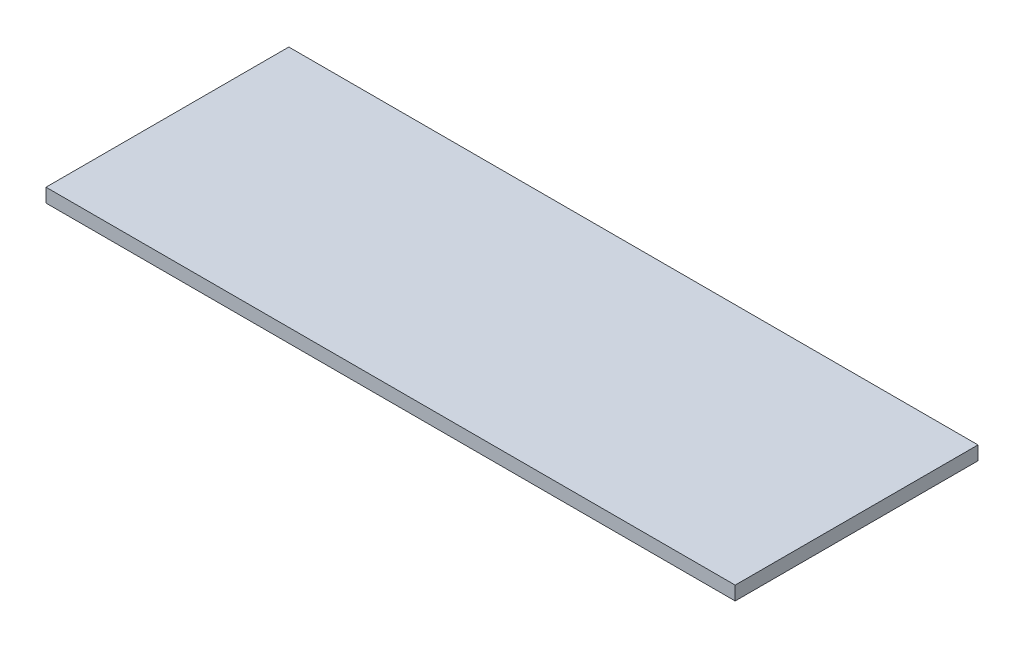
ISO-10303-21;
HEADER;
FILE_DESCRIPTION(('STEP AP214'),'2;1');
FILE_NAME('part.step','',(''),(''),'','','');
FILE_SCHEMA(('AUTOMOTIVE_DESIGN { 1 0 10303 214 1 1 1 1 }'));
ENDSEC;
DATA;
#1=APPLICATION_CONTEXT('core data for automotive mechanical design processes');
#2=APPLICATION_PROTOCOL_DEFINITION('international standard','automotive_design',2000,#1);
#3=PRODUCT_CONTEXT('',#1,'mechanical');
#4=PRODUCT('Part','Part','',(#3));
#5=PRODUCT_RELATED_PRODUCT_CATEGORY('part','',(#4));
#6=PRODUCT_DEFINITION_FORMATION('','',#4);
#7=PRODUCT_DEFINITION_CONTEXT('part definition',#1,'design');
#8=PRODUCT_DEFINITION('design','',#6,#7);
#9=PRODUCT_DEFINITION_SHAPE('','',#8);
#10=(LENGTH_UNIT() NAMED_UNIT(*) SI_UNIT(.MILLI.,.METRE.));
#11=(NAMED_UNIT(*) PLANE_ANGLE_UNIT() SI_UNIT($,.RADIAN.));
#12=(NAMED_UNIT(*) SI_UNIT($,.STERADIAN.) SOLID_ANGLE_UNIT());
#13=UNCERTAINTY_MEASURE_WITH_UNIT(LENGTH_MEASURE(1.E-05),#10,'distance_accuracy_value','');
#14=(GEOMETRIC_REPRESENTATION_CONTEXT(3) GLOBAL_UNCERTAINTY_ASSIGNED_CONTEXT((#13)) GLOBAL_UNIT_ASSIGNED_CONTEXT((#10,
#11,#12)) REPRESENTATION_CONTEXT('',''));
#15=CARTESIAN_POINT('',(0.,0.,0.));
#16=DIRECTION('',(0.,0.,1.));
#17=DIRECTION('',(1.,0.,0.));
#18=AXIS2_PLACEMENT_3D('',#15,#16,#17);
#19=CARTESIAN_POINT('',(0.,8.,0.));
#20=DIRECTION('',(0.,1.,0.));
#21=DIRECTION('',(0.,0.,1.));
#22=AXIS2_PLACEMENT_3D('',#19,#20,#21);
#23=PLANE('',#22);
#24=DIRECTION('',(0.,0.,1.));
#25=VECTOR('',#24,1.);
#26=CARTESIAN_POINT('',(-100.,8.,0.));
#27=LINE('',#26,#25);
#28=CARTESIAN_POINT('',(-100.,8.,-100.542496328956));
#29=VERTEX_POINT('',#28);
#30=CARTESIAN_POINT('',(-100.,8.,-30.0784515265633));
#31=VERTEX_POINT('',#30);
#32=EDGE_CURVE('E233',#29,#31,#27,.T.);
#33=ORIENTED_EDGE('',*,*,#32,.T.);
#34=DIRECTION('',(-1.,0.,0.));
#35=VECTOR('',#34,1.);
#36=CARTESIAN_POINT('',(0.,8.,-30.0784515265633));
#37=LINE('',#36,#35);
#38=CARTESIAN_POINT('',(100.,8.,-30.0784515265633));
#39=VERTEX_POINT('',#38);
#40=EDGE_CURVE('E226',#39,#31,#37,.T.);
#41=ORIENTED_EDGE('',*,*,#40,.F.);
#42=DIRECTION('',(0.,0.,1.));
#43=VECTOR('',#42,1.);
#44=CARTESIAN_POINT('',(100.,8.,0.));
#45=LINE('',#44,#43);
#46=CARTESIAN_POINT('',(100.,8.,-100.542496328956));
#47=VERTEX_POINT('',#46);
#48=EDGE_CURVE('E231',#47,#39,#45,.T.);
#49=ORIENTED_EDGE('',*,*,#48,.F.);
#50=DIRECTION('',(-1.,0.,0.));
#51=VECTOR('',#50,1.);
#52=CARTESIAN_POINT('',(0.,8.,-100.542496328956));
#53=LINE('',#52,#51);
#54=EDGE_CURVE('E199',#47,#29,#53,.T.);
#55=ORIENTED_EDGE('',*,*,#54,.T.);
#56=EDGE_LOOP('',(#33,#41,#49,#55));
#57=FACE_BOUND('',#56,.T.);
#58=ADVANCED_FACE('F182',(#57),#23,.T.);
#59=CARTESIAN_POINT('',(-100.,8.,0.));
#60=DIRECTION('',(1.,0.,0.));
#61=DIRECTION('',(0.,0.,-1.));
#62=AXIS2_PLACEMENT_3D('',#59,#60,#61);
#63=PLANE('',#62);
#64=DIRECTION('',(0.,0.,1.));
#65=VECTOR('',#64,1.);
#66=CARTESIAN_POINT('',(-100.,4.,0.));
#67=LINE('',#66,#65);
#68=CARTESIAN_POINT('',(-100.,4.,-100.542496328956));
#69=VERTEX_POINT('',#68);
#70=CARTESIAN_POINT('',(-100.,4.,-30.0784515265633));
#71=VERTEX_POINT('',#70);
#72=EDGE_CURVE('E243',#69,#71,#67,.T.);
#73=ORIENTED_EDGE('',*,*,#72,.T.);
#74=DIRECTION('',(0.,-1.,0.));
#75=VECTOR('',#74,1.);
#76=CARTESIAN_POINT('',(-100.,8.,-30.0784515265633));
#77=LINE('',#76,#75);
#78=EDGE_CURVE('E12',#31,#71,#77,.T.);
#79=ORIENTED_EDGE('',*,*,#78,.F.);
#80=ORIENTED_EDGE('',*,*,#32,.F.);
#81=DIRECTION('',(0.,-1.,0.));
#82=VECTOR('',#81,1.);
#83=CARTESIAN_POINT('',(-100.,8.,-100.542496328956));
#84=LINE('',#83,#82);
#85=EDGE_CURVE('E239',#29,#69,#84,.T.);
#86=ORIENTED_EDGE('',*,*,#85,.T.);
#87=EDGE_LOOP('',(#73,#79,#80,#86));
#88=FACE_BOUND('',#87,.T.);
#89=ADVANCED_FACE('F184',(#88),#63,.F.);
#90=CARTESIAN_POINT('',(0.,4.,0.));
#91=DIRECTION('',(0.,1.,0.));
#92=DIRECTION('',(0.,0.,1.));
#93=AXIS2_PLACEMENT_3D('',#90,#91,#92);
#94=PLANE('',#93);
#95=ORIENTED_EDGE('',*,*,#72,.F.);
#96=DIRECTION('',(-1.,0.,0.));
#97=VECTOR('',#96,1.);
#98=CARTESIAN_POINT('',(0.,4.,-100.542496328956));
#99=LINE('',#98,#97);
#100=CARTESIAN_POINT('',(100.,4.,-100.542496328956));
#101=VERTEX_POINT('',#100);
#102=EDGE_CURVE('E249',#101,#69,#99,.T.);
#103=ORIENTED_EDGE('',*,*,#102,.F.);
#104=DIRECTION('',(0.,0.,1.));
#105=VECTOR('',#104,1.);
#106=CARTESIAN_POINT('',(100.,4.,0.));
#107=LINE('',#106,#105);
#108=CARTESIAN_POINT('',(100.,4.,-30.0784515265633));
#109=VERTEX_POINT('',#108);
#110=EDGE_CURVE('E247',#101,#109,#107,.T.);
#111=ORIENTED_EDGE('',*,*,#110,.T.);
#112=DIRECTION('',(-1.,0.,0.));
#113=VECTOR('',#112,1.);
#114=CARTESIAN_POINT('',(0.,4.,-30.0784515265633));
#115=LINE('',#114,#113);
#116=EDGE_CURVE('E212',#109,#71,#115,.T.);
#117=ORIENTED_EDGE('',*,*,#116,.T.);
#118=EDGE_LOOP('',(#95,#103,#111,#117));
#119=FACE_BOUND('',#118,.T.);
#120=ADVANCED_FACE('F255',(#119),#94,.F.);
#121=CARTESIAN_POINT('',(0.,8.,-100.542496328956));
#122=DIRECTION('',(0.,0.,1.));
#123=DIRECTION('',(1.,0.,0.));
#124=AXIS2_PLACEMENT_3D('',#121,#122,#123);
#125=PLANE('',#124);
#126=ORIENTED_EDGE('',*,*,#102,.T.);
#127=ORIENTED_EDGE('',*,*,#85,.F.);
#128=ORIENTED_EDGE('',*,*,#54,.F.);
#129=DIRECTION('',(0.,-1.,0.));
#130=VECTOR('',#129,1.);
#131=CARTESIAN_POINT('',(100.,8.,-100.542496328956));
#132=LINE('',#131,#130);
#133=EDGE_CURVE('E230',#47,#101,#132,.T.);
#134=ORIENTED_EDGE('',*,*,#133,.T.);
#135=EDGE_LOOP('',(#126,#127,#128,#134));
#136=FACE_BOUND('',#135,.T.);
#137=ADVANCED_FACE('F254',(#136),#125,.F.);
#138=CARTESIAN_POINT('',(100.,8.,0.));
#139=DIRECTION('',(1.,0.,0.));
#140=DIRECTION('',(0.,0.,-1.));
#141=AXIS2_PLACEMENT_3D('',#138,#139,#140);
#142=PLANE('',#141);
#143=ORIENTED_EDGE('',*,*,#110,.F.);
#144=ORIENTED_EDGE('',*,*,#133,.F.);
#145=ORIENTED_EDGE('',*,*,#48,.T.);
#146=DIRECTION('',(0.,-1.,0.));
#147=VECTOR('',#146,1.);
#148=CARTESIAN_POINT('',(100.,8.,-30.0784515265633));
#149=LINE('',#148,#147);
#150=EDGE_CURVE('E191',#39,#109,#149,.T.);
#151=ORIENTED_EDGE('',*,*,#150,.T.);
#152=EDGE_LOOP('',(#143,#144,#145,#151));
#153=FACE_BOUND('',#152,.T.);
#154=ADVANCED_FACE('F236',(#153),#142,.T.);
#155=CARTESIAN_POINT('',(0.,8.,-30.0784515265633));
#156=DIRECTION('',(0.,0.,1.));
#157=DIRECTION('',(1.,0.,0.));
#158=AXIS2_PLACEMENT_3D('',#155,#156,#157);
#159=PLANE('',#158);
#160=ORIENTED_EDGE('',*,*,#116,.F.);
#161=ORIENTED_EDGE('',*,*,#150,.F.);
#162=ORIENTED_EDGE('',*,*,#40,.T.);
#163=ORIENTED_EDGE('',*,*,#78,.T.);
#164=EDGE_LOOP('',(#160,#161,#162,#163));
#165=FACE_BOUND('',#164,.T.);
#166=ADVANCED_FACE('F225',(#165),#159,.T.);
#167=CLOSED_SHELL('',(#58,#89,#120,#137,#154,#166));
#168=MANIFOLD_SOLID_BREP('B2',#167);
#169=ADVANCED_BREP_SHAPE_REPRESENTATION('',(#18,#168),#14);
#170=SHAPE_DEFINITION_REPRESENTATION(#9,#169);
ENDSEC;
END-ISO-10303-21;
